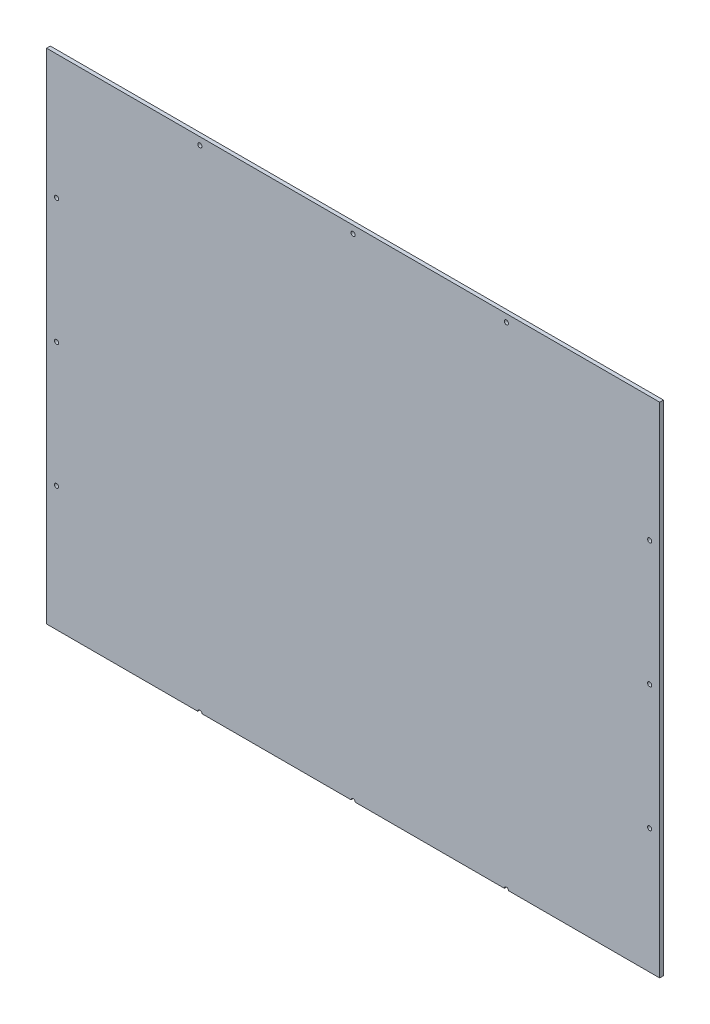
ISO-10303-21;
HEADER;
FILE_DESCRIPTION(('STEP AP214'),'2;1');
FILE_NAME('part.step','',(''),(''),'','','');
FILE_SCHEMA(('AUTOMOTIVE_DESIGN { 1 0 10303 214 1 1 1 1 }'));
ENDSEC;
DATA;
#1=APPLICATION_CONTEXT('core data for automotive mechanical design processes');
#2=APPLICATION_PROTOCOL_DEFINITION('international standard','automotive_design',2000,#1);
#3=PRODUCT_CONTEXT('',#1,'mechanical');
#4=PRODUCT('Part','Part','',(#3));
#5=PRODUCT_RELATED_PRODUCT_CATEGORY('part','',(#4));
#6=PRODUCT_DEFINITION_FORMATION('','',#4);
#7=PRODUCT_DEFINITION_CONTEXT('part definition',#1,'design');
#8=PRODUCT_DEFINITION('design','',#6,#7);
#9=PRODUCT_DEFINITION_SHAPE('','',#8);
#10=(LENGTH_UNIT() NAMED_UNIT(*) SI_UNIT(.MILLI.,.METRE.));
#11=(NAMED_UNIT(*) PLANE_ANGLE_UNIT() SI_UNIT($,.RADIAN.));
#12=(NAMED_UNIT(*) SI_UNIT($,.STERADIAN.) SOLID_ANGLE_UNIT());
#13=UNCERTAINTY_MEASURE_WITH_UNIT(LENGTH_MEASURE(1.E-05),#10,'distance_accuracy_value','');
#14=(GEOMETRIC_REPRESENTATION_CONTEXT(3) GLOBAL_UNCERTAINTY_ASSIGNED_CONTEXT((#13)) GLOBAL_UNIT_ASSIGNED_CONTEXT((#10,
#11,#12)) REPRESENTATION_CONTEXT('',''));
#15=CARTESIAN_POINT('',(0.,0.,0.));
#16=DIRECTION('',(0.,0.,1.));
#17=DIRECTION('',(1.,0.,0.));
#18=AXIS2_PLACEMENT_3D('',#15,#16,#17);
#19=CARTESIAN_POINT('',(-367.,-298.50470197277,4.5));
#20=DIRECTION('',(0.,1.,0.));
#21=DIRECTION('',(0.,0.,1.));
#22=AXIS2_PLACEMENT_3D('',#19,#20,#21);
#23=PLANE('',#22);
#24=DIRECTION('',(1.,0.,0.));
#25=VECTOR('',#24,1.);
#26=CARTESIAN_POINT('',(-367.,-298.50470197277,0.));
#27=LINE('',#26,#25);
#28=CARTESIAN_POINT('',(-181.000600483206,-298.50470197277,0.));
#29=VERTEX_POINT('',#28);
#30=CARTESIAN_POINT('',(-2.49939951679391,-298.50470197277,0.));
#31=VERTEX_POINT('',#30);
#32=EDGE_CURVE('E162',#29,#31,#27,.T.);
#33=ORIENTED_EDGE('',*,*,#32,.T.);
#34=DIRECTION('',(0.,0.,1.));
#35=VECTOR('',#34,1.);
#36=CARTESIAN_POINT('',(-2.49939951679391,-298.50470197277,-5.5));
#37=LINE('',#36,#35);
#38=CARTESIAN_POINT('',(-2.49939951679391,-298.50470197277,4.5));
#39=VERTEX_POINT('',#38);
#40=EDGE_CURVE('E62',#31,#39,#37,.T.);
#41=ORIENTED_EDGE('',*,*,#40,.T.);
#42=DIRECTION('',(1.,0.,0.));
#43=VECTOR('',#42,1.);
#44=CARTESIAN_POINT('',(-367.,-298.50470197277,4.5));
#45=LINE('',#44,#43);
#46=CARTESIAN_POINT('',(-181.000600483206,-298.50470197277,4.5));
#47=VERTEX_POINT('',#46);
#48=EDGE_CURVE('E138',#47,#39,#45,.T.);
#49=ORIENTED_EDGE('',*,*,#48,.F.);
#50=DIRECTION('',(0.,0.,1.));
#51=VECTOR('',#50,1.);
#52=CARTESIAN_POINT('',(-181.000600483206,-298.50470197277,-5.5));
#53=LINE('',#52,#51);
#54=EDGE_CURVE('E131',#47,#29,#53,.F.);
#55=ORIENTED_EDGE('',*,*,#54,.T.);
#56=EDGE_LOOP('',(#33,#41,#49,#55));
#57=FACE_BOUND('',#56,.T.);
#58=ADVANCED_FACE('F37',(#57),#23,.F.);
#59=CARTESIAN_POINT('',(-367.,-298.50470197277,0.));
#60=VERTEX_POINT('',#59);
#61=CARTESIAN_POINT('',(-185.999399516794,-298.50470197277,0.));
#62=VERTEX_POINT('',#61);
#63=EDGE_CURVE('E158',#60,#62,#27,.T.);
#64=ORIENTED_EDGE('',*,*,#63,.T.);
#65=DIRECTION('',(0.,0.,1.));
#66=VECTOR('',#65,1.);
#67=CARTESIAN_POINT('',(-185.999399516794,-298.50470197277,-5.5));
#68=LINE('',#67,#66);
#69=CARTESIAN_POINT('',(-185.999399516794,-298.50470197277,4.5));
#70=VERTEX_POINT('',#69);
#71=EDGE_CURVE('E192',#62,#70,#68,.T.);
#72=ORIENTED_EDGE('',*,*,#71,.T.);
#73=CARTESIAN_POINT('',(-367.,-298.50470197277,4.5));
#74=VERTEX_POINT('',#73);
#75=EDGE_CURVE('E141',#74,#70,#45,.T.);
#76=ORIENTED_EDGE('',*,*,#75,.F.);
#77=DIRECTION('',(0.,0.,-1.));
#78=VECTOR('',#77,1.);
#79=CARTESIAN_POINT('',(-367.,-298.50470197277,4.5));
#80=LINE('',#79,#78);
#81=EDGE_CURVE('E174',#74,#60,#80,.T.);
#82=ORIENTED_EDGE('',*,*,#81,.T.);
#83=EDGE_LOOP('',(#64,#72,#76,#82));
#84=FACE_BOUND('',#83,.T.);
#85=ADVANCED_FACE('F227',(#84),#23,.F.);
#86=CARTESIAN_POINT('',(2.49939951679391,-298.50470197277,4.5));
#87=VERTEX_POINT('',#86);
#88=CARTESIAN_POINT('',(181.000600483206,-298.50470197277,4.5));
#89=VERTEX_POINT('',#88);
#90=EDGE_CURVE('E128',#87,#89,#45,.T.);
#91=ORIENTED_EDGE('',*,*,#90,.F.);
#92=DIRECTION('',(0.,0.,1.));
#93=VECTOR('',#92,1.);
#94=CARTESIAN_POINT('',(2.49939951679391,-298.50470197277,-5.5));
#95=LINE('',#94,#93);
#96=CARTESIAN_POINT('',(2.49939951679391,-298.50470197277,0.));
#97=VERTEX_POINT('',#96);
#98=EDGE_CURVE('E197',#87,#97,#95,.F.);
#99=ORIENTED_EDGE('',*,*,#98,.T.);
#100=CARTESIAN_POINT('',(181.000600483206,-298.50470197277,0.));
#101=VERTEX_POINT('',#100);
#102=EDGE_CURVE('E130',#97,#101,#27,.T.);
#103=ORIENTED_EDGE('',*,*,#102,.T.);
#104=DIRECTION('',(0.,0.,1.));
#105=VECTOR('',#104,1.);
#106=CARTESIAN_POINT('',(181.000600483206,-298.50470197277,-5.5));
#107=LINE('',#106,#105);
#108=EDGE_CURVE('E54',#101,#89,#107,.T.);
#109=ORIENTED_EDGE('',*,*,#108,.T.);
#110=EDGE_LOOP('',(#91,#99,#103,#109));
#111=FACE_BOUND('',#110,.T.);
#112=ADVANCED_FACE('F126',(#111),#23,.F.);
#113=CARTESIAN_POINT('',(-367.,298.49529802723,4.5));
#114=DIRECTION('',(1.,0.,0.));
#115=DIRECTION('',(0.,1.,0.));
#116=AXIS2_PLACEMENT_3D('',#113,#114,#115);
#117=PLANE('',#116);
#118=DIRECTION('',(0.,-1.,0.));
#119=VECTOR('',#118,1.);
#120=CARTESIAN_POINT('',(-367.,298.49529802723,0.));
#121=LINE('',#120,#119);
#122=CARTESIAN_POINT('',(-367.,298.49529802723,0.));
#123=VERTEX_POINT('',#122);
#124=EDGE_CURVE('E154',#123,#60,#121,.T.);
#125=ORIENTED_EDGE('',*,*,#124,.T.);
#126=ORIENTED_EDGE('',*,*,#81,.F.);
#127=DIRECTION('',(0.,-1.,0.));
#128=VECTOR('',#127,1.);
#129=CARTESIAN_POINT('',(-367.,298.49529802723,4.5));
#130=LINE('',#129,#128);
#131=CARTESIAN_POINT('',(-367.,298.49529802723,4.5));
#132=VERTEX_POINT('',#131);
#133=EDGE_CURVE('E142',#132,#74,#130,.T.);
#134=ORIENTED_EDGE('',*,*,#133,.F.);
#135=DIRECTION('',(0.,0.,-1.));
#136=VECTOR('',#135,1.);
#137=CARTESIAN_POINT('',(-367.,298.49529802723,4.5));
#138=LINE('',#137,#136);
#139=EDGE_CURVE('E153',#132,#123,#138,.T.);
#140=ORIENTED_EDGE('',*,*,#139,.T.);
#141=EDGE_LOOP('',(#125,#126,#134,#140));
#142=FACE_BOUND('',#141,.T.);
#143=ADVANCED_FACE('F39',(#142),#117,.F.);
#144=CARTESIAN_POINT('',(185.999399516794,-298.50470197277,4.5));
#145=VERTEX_POINT('',#144);
#146=CARTESIAN_POINT('',(367.,-298.50470197277,4.5));
#147=VERTEX_POINT('',#146);
#148=EDGE_CURVE('E139',#145,#147,#45,.T.);
#149=ORIENTED_EDGE('',*,*,#148,.F.);
#150=DIRECTION('',(0.,0.,1.));
#151=VECTOR('',#150,1.);
#152=CARTESIAN_POINT('',(185.999399516794,-298.50470197277,-5.5));
#153=LINE('',#152,#151);
#154=CARTESIAN_POINT('',(185.999399516794,-298.50470197277,0.));
#155=VERTEX_POINT('',#154);
#156=EDGE_CURVE('E116',#145,#155,#153,.F.);
#157=ORIENTED_EDGE('',*,*,#156,.T.);
#158=CARTESIAN_POINT('',(367.,-298.50470197277,0.));
#159=VERTEX_POINT('',#158);
#160=EDGE_CURVE('E157',#155,#159,#27,.T.);
#161=ORIENTED_EDGE('',*,*,#160,.T.);
#162=DIRECTION('',(0.,0.,-1.));
#163=VECTOR('',#162,1.);
#164=CARTESIAN_POINT('',(367.,-298.50470197277,4.5));
#165=LINE('',#164,#163);
#166=EDGE_CURVE('E171',#147,#159,#165,.T.);
#167=ORIENTED_EDGE('',*,*,#166,.F.);
#168=EDGE_LOOP('',(#149,#157,#161,#167));
#169=FACE_BOUND('',#168,.T.);
#170=ADVANCED_FACE('F229',(#169),#23,.F.);
#171=CARTESIAN_POINT('',(367.,298.49529802723,4.5));
#172=DIRECTION('',(1.,0.,0.));
#173=DIRECTION('',(0.,1.,0.));
#174=AXIS2_PLACEMENT_3D('',#171,#172,#173);
#175=PLANE('',#174);
#176=DIRECTION('',(0.,-1.,0.));
#177=VECTOR('',#176,1.);
#178=CARTESIAN_POINT('',(367.,298.49529802723,0.));
#179=LINE('',#178,#177);
#180=CARTESIAN_POINT('',(367.,298.49529802723,0.));
#181=VERTEX_POINT('',#180);
#182=EDGE_CURVE('E161',#181,#159,#179,.T.);
#183=ORIENTED_EDGE('',*,*,#182,.F.);
#184=DIRECTION('',(0.,0.,-1.));
#185=VECTOR('',#184,1.);
#186=CARTESIAN_POINT('',(367.,298.49529802723,4.5));
#187=LINE('',#186,#185);
#188=CARTESIAN_POINT('',(367.,298.49529802723,4.5));
#189=VERTEX_POINT('',#188);
#190=EDGE_CURVE('E169',#189,#181,#187,.T.);
#191=ORIENTED_EDGE('',*,*,#190,.F.);
#192=DIRECTION('',(0.,-1.,0.));
#193=VECTOR('',#192,1.);
#194=CARTESIAN_POINT('',(367.,298.49529802723,4.5));
#195=LINE('',#194,#193);
#196=EDGE_CURVE('E146',#189,#147,#195,.T.);
#197=ORIENTED_EDGE('',*,*,#196,.T.);
#198=ORIENTED_EDGE('',*,*,#166,.T.);
#199=EDGE_LOOP('',(#183,#191,#197,#198));
#200=FACE_BOUND('',#199,.T.);
#201=ADVANCED_FACE('F237',(#200),#175,.T.);
#202=CARTESIAN_POINT('',(-367.,298.49529802723,4.5));
#203=DIRECTION('',(0.,1.,0.));
#204=DIRECTION('',(0.,0.,1.));
#205=AXIS2_PLACEMENT_3D('',#202,#203,#204);
#206=PLANE('',#205);
#207=DIRECTION('',(1.,0.,0.));
#208=VECTOR('',#207,1.);
#209=CARTESIAN_POINT('',(-367.,298.49529802723,0.));
#210=LINE('',#209,#208);
#211=EDGE_CURVE('E165',#123,#181,#210,.T.);
#212=ORIENTED_EDGE('',*,*,#211,.F.);
#213=ORIENTED_EDGE('',*,*,#139,.F.);
#214=DIRECTION('',(1.,0.,0.));
#215=VECTOR('',#214,1.);
#216=CARTESIAN_POINT('',(-367.,298.49529802723,4.5));
#217=LINE('',#216,#215);
#218=EDGE_CURVE('E150',#132,#189,#217,.T.);
#219=ORIENTED_EDGE('',*,*,#218,.T.);
#220=ORIENTED_EDGE('',*,*,#190,.T.);
#221=EDGE_LOOP('',(#212,#213,#219,#220));
#222=FACE_BOUND('',#221,.T.);
#223=ADVANCED_FACE('F243',(#222),#206,.T.);
#224=CARTESIAN_POINT('',(0.,0.,4.5));
#225=DIRECTION('',(0.,0.,1.));
#226=DIRECTION('',(1.,0.,0.));
#227=AXIS2_PLACEMENT_3D('',#224,#225,#226);
#228=PLANE('',#227);
#229=CARTESIAN_POINT('',(183.5,289.49529802723,4.5));
#230=DIRECTION('',(0.,0.,1.));
#231=DIRECTION('',(1.,0.,0.));
#232=AXIS2_PLACEMENT_3D('',#229,#230,#231);
#233=CIRCLE('',#232,2.5);
#234=CARTESIAN_POINT('',(186.,289.49529802723,4.5));
#235=VERTEX_POINT('',#234);
#236=EDGE_CURVE('E450',#235,#235,#233,.T.);
#237=ORIENTED_EDGE('',*,*,#236,.F.);
#238=EDGE_LOOP('',(#237));
#239=FACE_BOUND('',#238,.T.);
#240=CARTESIAN_POINT('',(0.,289.49529802723,4.5));
#241=DIRECTION('',(0.,0.,1.));
#242=DIRECTION('',(1.,0.,0.));
#243=AXIS2_PLACEMENT_3D('',#240,#241,#242);
#244=CIRCLE('',#243,2.5);
#245=CARTESIAN_POINT('',(2.5,289.49529802723,4.5));
#246=VERTEX_POINT('',#245);
#247=EDGE_CURVE('E457',#246,#246,#244,.T.);
#248=ORIENTED_EDGE('',*,*,#247,.F.);
#249=EDGE_LOOP('',(#248));
#250=FACE_BOUND('',#249,.T.);
#251=CARTESIAN_POINT('',(355.000000000001,149.245451757959,4.5));
#252=DIRECTION('',(0.,0.,1.));
#253=DIRECTION('',(-1.,0.,0.));
#254=AXIS2_PLACEMENT_3D('',#251,#252,#253);
#255=CIRCLE('',#254,2.50000000000002);
#256=CARTESIAN_POINT('',(352.500000000001,149.245451757959,4.5));
#257=VERTEX_POINT('',#256);
#258=EDGE_CURVE('E413',#257,#257,#255,.T.);
#259=ORIENTED_EDGE('',*,*,#258,.F.);
#260=EDGE_LOOP('',(#259));
#261=FACE_BOUND('',#260,.T.);
#262=CARTESIAN_POINT('',(355.,-0.00454824204071391,4.5));
#263=DIRECTION('',(0.,0.,1.));
#264=DIRECTION('',(-1.,0.,0.));
#265=AXIS2_PLACEMENT_3D('',#262,#263,#264);
#266=CIRCLE('',#265,2.50000000000002);
#267=CARTESIAN_POINT('',(352.5,-0.00454824204071391,4.5));
#268=VERTEX_POINT('',#267);
#269=EDGE_CURVE('E452',#268,#268,#266,.T.);
#270=ORIENTED_EDGE('',*,*,#269,.F.);
#271=EDGE_LOOP('',(#270));
#272=FACE_BOUND('',#271,.T.);
#273=CARTESIAN_POINT('',(0.,-298.449910956624,4.5));
#274=DIRECTION('',(0.,0.,1.));
#275=DIRECTION('',(1.,0.,0.));
#276=AXIS2_PLACEMENT_3D('',#273,#274,#275);
#277=CIRCLE('',#276,2.5);
#278=EDGE_CURVE('E137',#87,#39,#277,.T.);
#279=ORIENTED_EDGE('',*,*,#278,.F.);
#280=ORIENTED_EDGE('',*,*,#90,.T.);
#281=CARTESIAN_POINT('',(183.5,-298.449910956624,4.5));
#282=DIRECTION('',(0.,0.,1.));
#283=DIRECTION('',(1.,0.,0.));
#284=AXIS2_PLACEMENT_3D('',#281,#282,#283);
#285=CIRCLE('',#284,2.5);
#286=EDGE_CURVE('E113',#145,#89,#285,.T.);
#287=ORIENTED_EDGE('',*,*,#286,.F.);
#288=ORIENTED_EDGE('',*,*,#148,.T.);
#289=ORIENTED_EDGE('',*,*,#196,.F.);
#290=ORIENTED_EDGE('',*,*,#218,.F.);
#291=ORIENTED_EDGE('',*,*,#133,.T.);
#292=ORIENTED_EDGE('',*,*,#75,.T.);
#293=CARTESIAN_POINT('',(-183.5,-298.449910956625,4.5));
#294=DIRECTION('',(0.,0.,1.));
#295=DIRECTION('',(1.,0.,0.));
#296=AXIS2_PLACEMENT_3D('',#293,#294,#295);
#297=CIRCLE('',#296,2.5);
#298=EDGE_CURVE('E121',#47,#70,#297,.T.);
#299=ORIENTED_EDGE('',*,*,#298,.F.);
#300=ORIENTED_EDGE('',*,*,#48,.T.);
#301=EDGE_LOOP('',(#279,#280,#287,#288,#289,#290,#291,#292,#299,#300));
#302=FACE_BOUND('',#301,.T.);
#303=CARTESIAN_POINT('',(-355.,-0.00454824204071391,4.5));
#304=DIRECTION('',(0.,0.,1.));
#305=DIRECTION('',(1.,0.,0.));
#306=AXIS2_PLACEMENT_3D('',#303,#304,#305);
#307=CIRCLE('',#306,2.50000000000002);
#308=CARTESIAN_POINT('',(-352.5,-0.00454824204071391,4.5));
#309=VERTEX_POINT('',#308);
#310=EDGE_CURVE('E464',#309,#309,#307,.T.);
#311=ORIENTED_EDGE('',*,*,#310,.F.);
#312=EDGE_LOOP('',(#311));
#313=FACE_BOUND('',#312,.T.);
#314=CARTESIAN_POINT('',(-355.000000000001,149.245451757959,4.5));
#315=DIRECTION('',(0.,0.,1.));
#316=DIRECTION('',(1.,0.,0.));
#317=AXIS2_PLACEMENT_3D('',#314,#315,#316);
#318=CIRCLE('',#317,2.50000000000002);
#319=CARTESIAN_POINT('',(-352.500000000001,149.245451757959,4.5));
#320=VERTEX_POINT('',#319);
#321=EDGE_CURVE('E461',#320,#320,#318,.T.);
#322=ORIENTED_EDGE('',*,*,#321,.F.);
#323=EDGE_LOOP('',(#322));
#324=FACE_BOUND('',#323,.T.);
#325=CARTESIAN_POINT('',(355.,-149.254548242041,4.5));
#326=DIRECTION('',(0.,0.,1.));
#327=DIRECTION('',(-1.,0.,0.));
#328=AXIS2_PLACEMENT_3D('',#325,#326,#327);
#329=CIRCLE('',#328,2.50000000000002);
#330=CARTESIAN_POINT('',(352.5,-149.254548242041,4.5));
#331=VERTEX_POINT('',#330);
#332=EDGE_CURVE('E455',#331,#331,#329,.T.);
#333=ORIENTED_EDGE('',*,*,#332,.F.);
#334=EDGE_LOOP('',(#333));
#335=FACE_BOUND('',#334,.T.);
#336=CARTESIAN_POINT('',(-183.5,289.495298027228,4.5));
#337=DIRECTION('',(0.,0.,1.));
#338=DIRECTION('',(1.,0.,0.));
#339=AXIS2_PLACEMENT_3D('',#336,#337,#338);
#340=CIRCLE('',#339,2.5);
#341=CARTESIAN_POINT('',(-181.,289.495298027228,4.5));
#342=VERTEX_POINT('',#341);
#343=EDGE_CURVE('E120',#342,#342,#340,.T.);
#344=ORIENTED_EDGE('',*,*,#343,.F.);
#345=EDGE_LOOP('',(#344));
#346=FACE_BOUND('',#345,.T.);
#347=CARTESIAN_POINT('',(-355.,-149.254548242041,4.5));
#348=DIRECTION('',(0.,0.,1.));
#349=DIRECTION('',(1.,0.,0.));
#350=AXIS2_PLACEMENT_3D('',#347,#348,#349);
#351=CIRCLE('',#350,2.50000000000002);
#352=CARTESIAN_POINT('',(-352.5,-149.254548242041,4.5));
#353=VERTEX_POINT('',#352);
#354=EDGE_CURVE('E182',#353,#353,#351,.T.);
#355=ORIENTED_EDGE('',*,*,#354,.F.);
#356=EDGE_LOOP('',(#355));
#357=FACE_BOUND('',#356,.T.);
#358=ADVANCED_FACE('F134',(#239,#250,#261,#272,#302,#313,#324,#335,#346,#357),#228,.T.);
#359=CARTESIAN_POINT('',(0.,0.,0.));
#360=DIRECTION('',(0.,0.,1.));
#361=DIRECTION('',(1.,0.,0.));
#362=AXIS2_PLACEMENT_3D('',#359,#360,#361);
#363=PLANE('',#362);
#364=CARTESIAN_POINT('',(183.5,289.49529802723,0.));
#365=DIRECTION('',(0.,0.,1.));
#366=DIRECTION('',(1.,0.,0.));
#367=AXIS2_PLACEMENT_3D('',#364,#365,#366);
#368=CIRCLE('',#367,2.5);
#369=CARTESIAN_POINT('',(186.,289.49529802723,0.));
#370=VERTEX_POINT('',#369);
#371=EDGE_CURVE('E41',#370,#370,#368,.T.);
#372=ORIENTED_EDGE('',*,*,#371,.T.);
#373=EDGE_LOOP('',(#372));
#374=FACE_BOUND('',#373,.T.);
#375=CARTESIAN_POINT('',(0.,289.49529802723,0.));
#376=DIRECTION('',(0.,0.,1.));
#377=DIRECTION('',(1.,0.,0.));
#378=AXIS2_PLACEMENT_3D('',#375,#376,#377);
#379=CIRCLE('',#378,2.5);
#380=CARTESIAN_POINT('',(2.5,289.49529802723,0.));
#381=VERTEX_POINT('',#380);
#382=EDGE_CURVE('E204',#381,#381,#379,.T.);
#383=ORIENTED_EDGE('',*,*,#382,.T.);
#384=EDGE_LOOP('',(#383));
#385=FACE_BOUND('',#384,.T.);
#386=CARTESIAN_POINT('',(355.000000000001,149.245451757959,0.));
#387=DIRECTION('',(0.,0.,1.));
#388=DIRECTION('',(1.,0.,0.));
#389=AXIS2_PLACEMENT_3D('',#386,#387,#388);
#390=CIRCLE('',#389,2.50000000000002);
#391=CARTESIAN_POINT('',(357.500000000001,149.245451757959,0.));
#392=VERTEX_POINT('',#391);
#393=EDGE_CURVE('E202',#392,#392,#390,.T.);
#394=ORIENTED_EDGE('',*,*,#393,.T.);
#395=EDGE_LOOP('',(#394));
#396=FACE_BOUND('',#395,.T.);
#397=CARTESIAN_POINT('',(355.,-0.00454824204071391,0.));
#398=DIRECTION('',(0.,0.,1.));
#399=DIRECTION('',(1.,0.,0.));
#400=AXIS2_PLACEMENT_3D('',#397,#398,#399);
#401=CIRCLE('',#400,2.50000000000002);
#402=CARTESIAN_POINT('',(357.500000000001,-0.00454824204071391,0.));
#403=VERTEX_POINT('',#402);
#404=EDGE_CURVE('E199',#403,#403,#401,.T.);
#405=ORIENTED_EDGE('',*,*,#404,.T.);
#406=EDGE_LOOP('',(#405));
#407=FACE_BOUND('',#406,.T.);
#408=CARTESIAN_POINT('',(-355.,-0.00454824204071391,0.));
#409=DIRECTION('',(0.,0.,1.));
#410=DIRECTION('',(1.,0.,0.));
#411=AXIS2_PLACEMENT_3D('',#408,#409,#410);
#412=CIRCLE('',#411,2.50000000000002);
#413=CARTESIAN_POINT('',(-352.5,-0.00454824204071391,0.));
#414=VERTEX_POINT('',#413);
#415=EDGE_CURVE('E195',#414,#414,#412,.T.);
#416=ORIENTED_EDGE('',*,*,#415,.T.);
#417=EDGE_LOOP('',(#416));
#418=FACE_BOUND('',#417,.T.);
#419=CARTESIAN_POINT('',(-355.000000000001,149.245451757959,0.));
#420=DIRECTION('',(0.,0.,1.));
#421=DIRECTION('',(1.,0.,0.));
#422=AXIS2_PLACEMENT_3D('',#419,#420,#421);
#423=CIRCLE('',#422,2.50000000000002);
#424=CARTESIAN_POINT('',(-352.500000000001,149.245451757959,0.));
#425=VERTEX_POINT('',#424);
#426=EDGE_CURVE('E191',#425,#425,#423,.T.);
#427=ORIENTED_EDGE('',*,*,#426,.T.);
#428=EDGE_LOOP('',(#427));
#429=FACE_BOUND('',#428,.T.);
#430=CARTESIAN_POINT('',(355.,-149.254548242041,0.));
#431=DIRECTION('',(0.,0.,1.));
#432=DIRECTION('',(1.,0.,0.));
#433=AXIS2_PLACEMENT_3D('',#430,#431,#432);
#434=CIRCLE('',#433,2.50000000000002);
#435=CARTESIAN_POINT('',(357.5,-149.254548242041,0.));
#436=VERTEX_POINT('',#435);
#437=EDGE_CURVE('E188',#436,#436,#434,.T.);
#438=ORIENTED_EDGE('',*,*,#437,.T.);
#439=EDGE_LOOP('',(#438));
#440=FACE_BOUND('',#439,.T.);
#441=CARTESIAN_POINT('',(-183.5,289.495298027228,0.));
#442=DIRECTION('',(0.,0.,1.));
#443=DIRECTION('',(1.,0.,0.));
#444=AXIS2_PLACEMENT_3D('',#441,#442,#443);
#445=CIRCLE('',#444,2.5);
#446=CARTESIAN_POINT('',(-181.,289.495298027228,0.));
#447=VERTEX_POINT('',#446);
#448=EDGE_CURVE('E181',#447,#447,#445,.T.);
#449=ORIENTED_EDGE('',*,*,#448,.T.);
#450=EDGE_LOOP('',(#449));
#451=FACE_BOUND('',#450,.T.);
#452=CARTESIAN_POINT('',(-355.,-149.254548242041,0.));
#453=DIRECTION('',(0.,0.,1.));
#454=DIRECTION('',(1.,0.,0.));
#455=AXIS2_PLACEMENT_3D('',#452,#453,#454);
#456=CIRCLE('',#455,2.50000000000002);
#457=CARTESIAN_POINT('',(-352.5,-149.254548242041,0.));
#458=VERTEX_POINT('',#457);
#459=EDGE_CURVE('E178',#458,#458,#456,.T.);
#460=ORIENTED_EDGE('',*,*,#459,.T.);
#461=EDGE_LOOP('',(#460));
#462=FACE_BOUND('',#461,.T.);
#463=ORIENTED_EDGE('',*,*,#102,.F.);
#464=CARTESIAN_POINT('',(0.,-298.449910956624,0.));
#465=DIRECTION('',(0.,0.,1.));
#466=DIRECTION('',(1.,0.,0.));
#467=AXIS2_PLACEMENT_3D('',#464,#465,#466);
#468=CIRCLE('',#467,2.5);
#469=EDGE_CURVE('E11',#97,#31,#468,.T.);
#470=ORIENTED_EDGE('',*,*,#469,.T.);
#471=ORIENTED_EDGE('',*,*,#32,.F.);
#472=CARTESIAN_POINT('',(-183.5,-298.449910956625,0.));
#473=DIRECTION('',(0.,0.,1.));
#474=DIRECTION('',(1.,0.,0.));
#475=AXIS2_PLACEMENT_3D('',#472,#473,#474);
#476=CIRCLE('',#475,2.5);
#477=EDGE_CURVE('E46',#29,#62,#476,.T.);
#478=ORIENTED_EDGE('',*,*,#477,.T.);
#479=ORIENTED_EDGE('',*,*,#63,.F.);
#480=ORIENTED_EDGE('',*,*,#124,.F.);
#481=ORIENTED_EDGE('',*,*,#211,.T.);
#482=ORIENTED_EDGE('',*,*,#182,.T.);
#483=ORIENTED_EDGE('',*,*,#160,.F.);
#484=CARTESIAN_POINT('',(183.5,-298.449910956624,0.));
#485=DIRECTION('',(0.,0.,1.));
#486=DIRECTION('',(1.,0.,0.));
#487=AXIS2_PLACEMENT_3D('',#484,#485,#486);
#488=CIRCLE('',#487,2.5);
#489=EDGE_CURVE('E177',#155,#101,#488,.T.);
#490=ORIENTED_EDGE('',*,*,#489,.T.);
#491=EDGE_LOOP('',(#463,#470,#471,#478,#479,#480,#481,#482,#483,#490));
#492=FACE_BOUND('',#491,.T.);
#493=ADVANCED_FACE('F211',(#374,#385,#396,#407,#418,#429,#440,#451,#462,#492),#363,.F.);
#494=CARTESIAN_POINT('',(-355.,-149.254548242041,-5.5));
#495=DIRECTION('',(0.,0.,1.));
#496=DIRECTION('',(1.,0.,0.));
#497=AXIS2_PLACEMENT_3D('',#494,#495,#496);
#498=CYLINDRICAL_SURFACE('',#497,2.50000000000002);
#499=ORIENTED_EDGE('',*,*,#354,.T.);
#500=EDGE_LOOP('',(#499));
#501=FACE_BOUND('',#500,.T.);
#502=ORIENTED_EDGE('',*,*,#459,.F.);
#503=EDGE_LOOP('',(#502));
#504=FACE_BOUND('',#503,.T.);
#505=ADVANCED_FACE('F293',(#501,#504),#498,.F.);
#506=CARTESIAN_POINT('',(-183.5,289.495298027228,-5.5));
#507=DIRECTION('',(0.,0.,1.));
#508=DIRECTION('',(1.,0.,0.));
#509=AXIS2_PLACEMENT_3D('',#506,#507,#508);
#510=CYLINDRICAL_SURFACE('',#509,2.5);
#511=ORIENTED_EDGE('',*,*,#343,.T.);
#512=EDGE_LOOP('',(#511));
#513=FACE_BOUND('',#512,.T.);
#514=ORIENTED_EDGE('',*,*,#448,.F.);
#515=EDGE_LOOP('',(#514));
#516=FACE_BOUND('',#515,.T.);
#517=ADVANCED_FACE('F311',(#513,#516),#510,.F.);
#518=CARTESIAN_POINT('',(183.5,-298.449910956624,-5.5));
#519=DIRECTION('',(0.,0.,1.));
#520=DIRECTION('',(1.,0.,0.));
#521=AXIS2_PLACEMENT_3D('',#518,#519,#520);
#522=CYLINDRICAL_SURFACE('',#521,2.5);
#523=ORIENTED_EDGE('',*,*,#489,.F.);
#524=ORIENTED_EDGE('',*,*,#156,.F.);
#525=ORIENTED_EDGE('',*,*,#286,.T.);
#526=ORIENTED_EDGE('',*,*,#108,.F.);
#527=EDGE_LOOP('',(#523,#524,#525,#526));
#528=FACE_BOUND('',#527,.T.);
#529=ADVANCED_FACE('F114',(#528),#522,.F.);
#530=CARTESIAN_POINT('',(-183.5,-298.449910956625,-5.5));
#531=DIRECTION('',(0.,0.,1.));
#532=DIRECTION('',(1.,0.,0.));
#533=AXIS2_PLACEMENT_3D('',#530,#531,#532);
#534=CYLINDRICAL_SURFACE('',#533,2.5);
#535=ORIENTED_EDGE('',*,*,#477,.F.);
#536=ORIENTED_EDGE('',*,*,#54,.F.);
#537=ORIENTED_EDGE('',*,*,#298,.T.);
#538=ORIENTED_EDGE('',*,*,#71,.F.);
#539=EDGE_LOOP('',(#535,#536,#537,#538));
#540=FACE_BOUND('',#539,.T.);
#541=ADVANCED_FACE('F325',(#540),#534,.F.);
#542=CARTESIAN_POINT('',(355.,-149.254548242041,-5.5));
#543=DIRECTION('',(0.,0.,1.));
#544=DIRECTION('',(1.,0.,0.));
#545=AXIS2_PLACEMENT_3D('',#542,#543,#544);
#546=CYLINDRICAL_SURFACE('',#545,2.50000000000002);
#547=ORIENTED_EDGE('',*,*,#332,.T.);
#548=EDGE_LOOP('',(#547));
#549=FACE_BOUND('',#548,.T.);
#550=ORIENTED_EDGE('',*,*,#437,.F.);
#551=EDGE_LOOP('',(#550));
#552=FACE_BOUND('',#551,.T.);
#553=ADVANCED_FACE('F332',(#549,#552),#546,.F.);
#554=CARTESIAN_POINT('',(-355.000000000001,149.245451757959,-5.5));
#555=DIRECTION('',(0.,0.,1.));
#556=DIRECTION('',(1.,0.,0.));
#557=AXIS2_PLACEMENT_3D('',#554,#555,#556);
#558=CYLINDRICAL_SURFACE('',#557,2.50000000000002);
#559=ORIENTED_EDGE('',*,*,#321,.T.);
#560=EDGE_LOOP('',(#559));
#561=FACE_BOUND('',#560,.T.);
#562=ORIENTED_EDGE('',*,*,#426,.F.);
#563=EDGE_LOOP('',(#562));
#564=FACE_BOUND('',#563,.T.);
#565=ADVANCED_FACE('F340',(#561,#564),#558,.F.);
#566=CARTESIAN_POINT('',(-355.,-0.00454824204071391,-5.5));
#567=DIRECTION('',(0.,0.,1.));
#568=DIRECTION('',(1.,0.,0.));
#569=AXIS2_PLACEMENT_3D('',#566,#567,#568);
#570=CYLINDRICAL_SURFACE('',#569,2.50000000000002);
#571=ORIENTED_EDGE('',*,*,#310,.T.);
#572=EDGE_LOOP('',(#571));
#573=FACE_BOUND('',#572,.T.);
#574=ORIENTED_EDGE('',*,*,#415,.F.);
#575=EDGE_LOOP('',(#574));
#576=FACE_BOUND('',#575,.T.);
#577=ADVANCED_FACE('F348',(#573,#576),#570,.F.);
#578=CARTESIAN_POINT('',(0.,-298.449910956624,-5.5));
#579=DIRECTION('',(0.,0.,1.));
#580=DIRECTION('',(1.,0.,0.));
#581=AXIS2_PLACEMENT_3D('',#578,#579,#580);
#582=CYLINDRICAL_SURFACE('',#581,2.5);
#583=ORIENTED_EDGE('',*,*,#469,.F.);
#584=ORIENTED_EDGE('',*,*,#98,.F.);
#585=ORIENTED_EDGE('',*,*,#278,.T.);
#586=ORIENTED_EDGE('',*,*,#40,.F.);
#587=EDGE_LOOP('',(#583,#584,#585,#586));
#588=FACE_BOUND('',#587,.T.);
#589=ADVANCED_FACE('F355',(#588),#582,.F.);
#590=CARTESIAN_POINT('',(355.,-0.00454824204071391,-5.5));
#591=DIRECTION('',(0.,0.,1.));
#592=DIRECTION('',(1.,0.,0.));
#593=AXIS2_PLACEMENT_3D('',#590,#591,#592);
#594=CYLINDRICAL_SURFACE('',#593,2.50000000000002);
#595=ORIENTED_EDGE('',*,*,#269,.T.);
#596=EDGE_LOOP('',(#595));
#597=FACE_BOUND('',#596,.T.);
#598=ORIENTED_EDGE('',*,*,#404,.F.);
#599=EDGE_LOOP('',(#598));
#600=FACE_BOUND('',#599,.T.);
#601=ADVANCED_FACE('F363',(#597,#600),#594,.F.);
#602=CARTESIAN_POINT('',(355.000000000001,149.245451757959,-5.5));
#603=DIRECTION('',(0.,0.,1.));
#604=DIRECTION('',(1.,0.,0.));
#605=AXIS2_PLACEMENT_3D('',#602,#603,#604);
#606=CYLINDRICAL_SURFACE('',#605,2.50000000000002);
#607=ORIENTED_EDGE('',*,*,#258,.T.);
#608=EDGE_LOOP('',(#607));
#609=FACE_BOUND('',#608,.T.);
#610=ORIENTED_EDGE('',*,*,#393,.F.);
#611=EDGE_LOOP('',(#610));
#612=FACE_BOUND('',#611,.T.);
#613=ADVANCED_FACE('F221',(#609,#612),#606,.F.);
#614=CARTESIAN_POINT('',(0.,289.49529802723,-5.5));
#615=DIRECTION('',(0.,0.,1.));
#616=DIRECTION('',(1.,0.,0.));
#617=AXIS2_PLACEMENT_3D('',#614,#615,#616);
#618=CYLINDRICAL_SURFACE('',#617,2.5);
#619=ORIENTED_EDGE('',*,*,#247,.T.);
#620=EDGE_LOOP('',(#619));
#621=FACE_BOUND('',#620,.T.);
#622=ORIENTED_EDGE('',*,*,#382,.F.);
#623=EDGE_LOOP('',(#622));
#624=FACE_BOUND('',#623,.T.);
#625=ADVANCED_FACE('F215',(#621,#624),#618,.F.);
#626=CARTESIAN_POINT('',(183.5,289.49529802723,-5.5));
#627=DIRECTION('',(0.,0.,1.));
#628=DIRECTION('',(1.,0.,0.));
#629=AXIS2_PLACEMENT_3D('',#626,#627,#628);
#630=CYLINDRICAL_SURFACE('',#629,2.5);
#631=ORIENTED_EDGE('',*,*,#236,.T.);
#632=EDGE_LOOP('',(#631));
#633=FACE_BOUND('',#632,.T.);
#634=ORIENTED_EDGE('',*,*,#371,.F.);
#635=EDGE_LOOP('',(#634));
#636=FACE_BOUND('',#635,.T.);
#637=ADVANCED_FACE('F213',(#633,#636),#630,.F.);
#638=CLOSED_SHELL('',(#58,#85,#112,#143,#170,#201,#223,#358,#493,#505,#517,#529,#541,#553,#565,
#577,#589,#601,#613,#625,#637));
#639=MANIFOLD_SOLID_BREP('B2',#638);
#640=ADVANCED_BREP_SHAPE_REPRESENTATION('',(#18,#639),#14);
#641=SHAPE_DEFINITION_REPRESENTATION(#9,#640);
ENDSEC;
END-ISO-10303-21;
